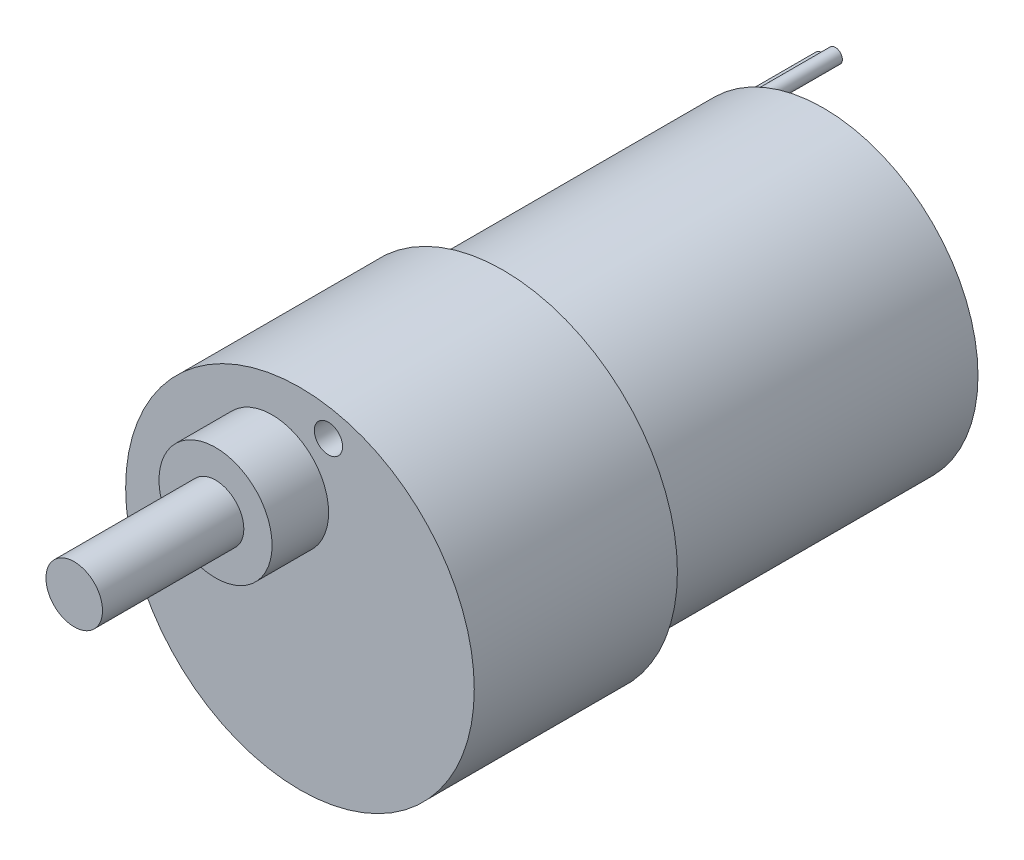
ISO-10303-21;
HEADER;
FILE_DESCRIPTION(('STEP AP214'),'2;1');
FILE_NAME('part.step','',(''),(''),'','','');
FILE_SCHEMA(('AUTOMOTIVE_DESIGN { 1 0 10303 214 1 1 1 1 }'));
ENDSEC;
DATA;
#1=APPLICATION_CONTEXT('core data for automotive mechanical design processes');
#2=APPLICATION_PROTOCOL_DEFINITION('international standard','automotive_design',2000,#1);
#3=PRODUCT_CONTEXT('',#1,'mechanical');
#4=PRODUCT('Part','Part','',(#3));
#5=PRODUCT_RELATED_PRODUCT_CATEGORY('part','',(#4));
#6=PRODUCT_DEFINITION_FORMATION('','',#4);
#7=PRODUCT_DEFINITION_CONTEXT('part definition',#1,'design');
#8=PRODUCT_DEFINITION('design','',#6,#7);
#9=PRODUCT_DEFINITION_SHAPE('','',#8);
#10=(LENGTH_UNIT() NAMED_UNIT(*) SI_UNIT(.MILLI.,.METRE.));
#11=(NAMED_UNIT(*) PLANE_ANGLE_UNIT() SI_UNIT($,.RADIAN.));
#12=(NAMED_UNIT(*) SI_UNIT($,.STERADIAN.) SOLID_ANGLE_UNIT());
#13=UNCERTAINTY_MEASURE_WITH_UNIT(LENGTH_MEASURE(1.E-05),#10,'distance_accuracy_value','');
#14=(GEOMETRIC_REPRESENTATION_CONTEXT(3) GLOBAL_UNCERTAINTY_ASSIGNED_CONTEXT((#13)) GLOBAL_UNIT_ASSIGNED_CONTEXT((#10,
#11,#12)) REPRESENTATION_CONTEXT('',''));
#15=CARTESIAN_POINT('',(0.,0.,0.));
#16=DIRECTION('',(0.,0.,1.));
#17=DIRECTION('',(1.,0.,0.));
#18=AXIS2_PLACEMENT_3D('',#15,#16,#17);
#19=CARTESIAN_POINT('',(-38.6606230909148,1.93971984366182,21.56));
#20=DIRECTION('',(0.,0.,-1.));
#21=DIRECTION('',(-1.,0.,0.));
#22=AXIS2_PLACEMENT_3D('',#19,#20,#21);
#23=CYLINDRICAL_SURFACE('',#22,18.5);
#24=CARTESIAN_POINT('',(-38.6606230909148,1.93971984366182,21.56));
#25=DIRECTION('',(0.,0.,1.));
#26=DIRECTION('',(1.,0.,0.));
#27=AXIS2_PLACEMENT_3D('',#24,#25,#26);
#28=CIRCLE('',#27,18.5);
#29=CARTESIAN_POINT('',(-20.1606230909148,1.93971984366182,21.56));
#30=VERTEX_POINT('',#29);
#31=EDGE_CURVE('E43',#30,#30,#28,.T.);
#32=ORIENTED_EDGE('',*,*,#31,.F.);
#33=EDGE_LOOP('',(#32));
#34=FACE_BOUND('',#33,.T.);
#35=CARTESIAN_POINT('',(-38.6606230909148,1.93971984366182,0.));
#36=DIRECTION('',(0.,0.,1.));
#37=DIRECTION('',(1.,0.,0.));
#38=AXIS2_PLACEMENT_3D('',#35,#36,#37);
#39=CIRCLE('',#38,18.5);
#40=CARTESIAN_POINT('',(-20.1606230909148,1.93971984366182,0.));
#41=VERTEX_POINT('',#40);
#42=EDGE_CURVE('E34',#41,#41,#39,.T.);
#43=ORIENTED_EDGE('',*,*,#42,.T.);
#44=EDGE_LOOP('',(#43));
#45=FACE_BOUND('',#44,.T.);
#46=ADVANCED_FACE('F31',(#34,#45),#23,.T.);
#47=CARTESIAN_POINT('',(-38.6606230909148,1.93971984366182,21.56));
#48=DIRECTION('',(0.,0.,1.));
#49=DIRECTION('',(1.,0.,0.));
#50=AXIS2_PLACEMENT_3D('',#47,#48,#49);
#51=PLANE('',#50);
#52=CARTESIAN_POINT('',(-35.6385530954242,17.2482006752359,21.56));
#53=DIRECTION('',(0.,0.,1.));
#54=DIRECTION('',(1.,0.,0.));
#55=AXIS2_PLACEMENT_3D('',#52,#53,#54);
#56=CIRCLE('',#55,1.5);
#57=CARTESIAN_POINT('',(-34.1385530954242,17.2482006752359,21.56));
#58=VERTEX_POINT('',#57);
#59=EDGE_CURVE('E53',#58,#58,#56,.T.);
#60=ORIENTED_EDGE('',*,*,#59,.F.);
#61=EDGE_LOOP('',(#60));
#62=FACE_BOUND('',#61,.T.);
#63=CARTESIAN_POINT('',(-41.6188546381153,10.4396531441735,21.56));
#64=DIRECTION('',(0.,0.,1.));
#65=DIRECTION('',(1.,0.,0.));
#66=AXIS2_PLACEMENT_3D('',#63,#64,#65);
#67=CIRCLE('',#66,6.);
#68=CARTESIAN_POINT('',(-35.6188546381153,10.4396531441735,21.56));
#69=VERTEX_POINT('',#68);
#70=EDGE_CURVE('E57',#69,#69,#67,.T.);
#71=ORIENTED_EDGE('',*,*,#70,.F.);
#72=EDGE_LOOP('',(#71));
#73=FACE_BOUND('',#72,.T.);
#74=ORIENTED_EDGE('',*,*,#31,.T.);
#75=EDGE_LOOP('',(#74));
#76=FACE_BOUND('',#75,.T.);
#77=ADVANCED_FACE('F73',(#62,#73,#76),#51,.T.);
#78=CARTESIAN_POINT('',(-38.6606230909148,1.93971984366182,0.));
#79=DIRECTION('',(0.,0.,1.));
#80=DIRECTION('',(1.,0.,0.));
#81=AXIS2_PLACEMENT_3D('',#78,#79,#80);
#82=PLANE('',#81);
#83=CARTESIAN_POINT('',(-38.6606230909148,1.93971984366182,0.));
#84=DIRECTION('',(0.,0.,-1.));
#85=DIRECTION('',(-1.,0.,0.));
#86=AXIS2_PLACEMENT_3D('',#83,#84,#85);
#87=CIRCLE('',#86,16.4);
#88=CARTESIAN_POINT('',(-55.0606230909148,1.93971984366182,0.));
#89=VERTEX_POINT('',#88);
#90=EDGE_CURVE('E10',#89,#89,#87,.T.);
#91=ORIENTED_EDGE('',*,*,#90,.F.);
#92=EDGE_LOOP('',(#91));
#93=FACE_BOUND('',#92,.T.);
#94=ORIENTED_EDGE('',*,*,#42,.F.);
#95=EDGE_LOOP('',(#94));
#96=FACE_BOUND('',#95,.T.);
#97=ADVANCED_FACE('F70',(#93,#96),#82,.F.);
#98=CARTESIAN_POINT('',(-41.6188546381153,10.4396531441735,27.56));
#99=DIRECTION('',(0.,0.,-1.));
#100=DIRECTION('',(-1.,0.,0.));
#101=AXIS2_PLACEMENT_3D('',#98,#99,#100);
#102=CYLINDRICAL_SURFACE('',#101,6.);
#103=CARTESIAN_POINT('',(-41.6188546381153,10.4396531441735,27.56));
#104=DIRECTION('',(0.,0.,1.));
#105=DIRECTION('',(1.,0.,0.));
#106=AXIS2_PLACEMENT_3D('',#103,#104,#105);
#107=CIRCLE('',#106,6.);
#108=CARTESIAN_POINT('',(-35.6188546381153,10.4396531441735,27.56));
#109=VERTEX_POINT('',#108);
#110=EDGE_CURVE('E59',#109,#109,#107,.T.);
#111=ORIENTED_EDGE('',*,*,#110,.F.);
#112=EDGE_LOOP('',(#111));
#113=FACE_BOUND('',#112,.T.);
#114=ORIENTED_EDGE('',*,*,#70,.T.);
#115=EDGE_LOOP('',(#114));
#116=FACE_BOUND('',#115,.T.);
#117=ADVANCED_FACE('F72',(#113,#116),#102,.T.);
#118=CARTESIAN_POINT('',(-41.6188546381153,10.4396531441735,27.56));
#119=DIRECTION('',(0.,0.,1.));
#120=DIRECTION('',(1.,0.,0.));
#121=AXIS2_PLACEMENT_3D('',#118,#119,#120);
#122=PLANE('',#121);
#123=CARTESIAN_POINT('',(-41.6188546381153,10.4396531441735,27.56));
#124=DIRECTION('',(0.,0.,1.));
#125=DIRECTION('',(1.,0.,0.));
#126=AXIS2_PLACEMENT_3D('',#123,#124,#125);
#127=CIRCLE('',#126,3.);
#128=CARTESIAN_POINT('',(-38.6188546381153,10.4396531441735,27.56));
#129=VERTEX_POINT('',#128);
#130=EDGE_CURVE('E38',#129,#129,#127,.T.);
#131=ORIENTED_EDGE('',*,*,#130,.F.);
#132=EDGE_LOOP('',(#131));
#133=FACE_BOUND('',#132,.T.);
#134=ORIENTED_EDGE('',*,*,#110,.T.);
#135=EDGE_LOOP('',(#134));
#136=FACE_BOUND('',#135,.T.);
#137=ADVANCED_FACE('F79',(#133,#136),#122,.T.);
#138=CARTESIAN_POINT('',(-41.6188546381153,10.4396531441735,42.56));
#139=DIRECTION('',(0.,0.,-1.));
#140=DIRECTION('',(-1.,0.,0.));
#141=AXIS2_PLACEMENT_3D('',#138,#139,#140);
#142=CYLINDRICAL_SURFACE('',#141,3.);
#143=CARTESIAN_POINT('',(-41.6188546381153,10.4396531441735,42.56));
#144=DIRECTION('',(0.,0.,1.));
#145=DIRECTION('',(1.,0.,0.));
#146=AXIS2_PLACEMENT_3D('',#143,#144,#145);
#147=CIRCLE('',#146,3.);
#148=CARTESIAN_POINT('',(-38.6188546381153,10.4396531441735,42.56));
#149=VERTEX_POINT('',#148);
#150=EDGE_CURVE('E52',#149,#149,#147,.T.);
#151=ORIENTED_EDGE('',*,*,#150,.F.);
#152=EDGE_LOOP('',(#151));
#153=FACE_BOUND('',#152,.T.);
#154=ORIENTED_EDGE('',*,*,#130,.T.);
#155=EDGE_LOOP('',(#154));
#156=FACE_BOUND('',#155,.T.);
#157=ADVANCED_FACE('F191',(#153,#156),#142,.T.);
#158=CARTESIAN_POINT('',(-41.6188546381153,10.4396531441735,42.56));
#159=DIRECTION('',(0.,0.,1.));
#160=DIRECTION('',(1.,0.,0.));
#161=AXIS2_PLACEMENT_3D('',#158,#159,#160);
#162=PLANE('',#161);
#163=ORIENTED_EDGE('',*,*,#150,.T.);
#164=EDGE_LOOP('',(#163));
#165=FACE_BOUND('',#164,.T.);
#166=ADVANCED_FACE('F100',(#165),#162,.T.);
#167=CARTESIAN_POINT('',(-35.6385530954242,17.2482006752359,17.56));
#168=DIRECTION('',(0.,0.,1.));
#169=DIRECTION('',(1.,0.,0.));
#170=AXIS2_PLACEMENT_3D('',#167,#168,#169);
#171=CYLINDRICAL_SURFACE('',#170,1.5);
#172=CARTESIAN_POINT('',(-35.6385530954242,17.2482006752359,17.56));
#173=DIRECTION('',(0.,0.,1.));
#174=DIRECTION('',(1.,0.,0.));
#175=AXIS2_PLACEMENT_3D('',#172,#173,#174);
#176=CIRCLE('',#175,1.5);
#177=CARTESIAN_POINT('',(-34.1385530954242,17.2482006752359,17.56));
#178=VERTEX_POINT('',#177);
#179=EDGE_CURVE('E49',#178,#178,#176,.T.);
#180=ORIENTED_EDGE('',*,*,#179,.F.);
#181=EDGE_LOOP('',(#180));
#182=FACE_BOUND('',#181,.T.);
#183=ORIENTED_EDGE('',*,*,#59,.T.);
#184=EDGE_LOOP('',(#183));
#185=FACE_BOUND('',#184,.T.);
#186=ADVANCED_FACE('F105',(#182,#185),#171,.F.);
#187=CARTESIAN_POINT('',(-35.6385530954242,17.2482006752359,17.56));
#188=DIRECTION('',(0.,0.,1.));
#189=DIRECTION('',(1.,0.,0.));
#190=AXIS2_PLACEMENT_3D('',#187,#188,#189);
#191=PLANE('',#190);
#192=ORIENTED_EDGE('',*,*,#179,.T.);
#193=EDGE_LOOP('',(#192));
#194=FACE_BOUND('',#193,.T.);
#195=ADVANCED_FACE('F110',(#194),#191,.T.);
#196=CARTESIAN_POINT('',(-38.6606230909148,1.93971984366182,-34.));
#197=DIRECTION('',(0.,0.,1.));
#198=DIRECTION('',(1.,0.,0.));
#199=AXIS2_PLACEMENT_3D('',#196,#197,#198);
#200=CYLINDRICAL_SURFACE('',#199,16.4);
#201=CARTESIAN_POINT('',(-38.6606230909148,1.93971984366182,-34.));
#202=DIRECTION('',(0.,0.,-1.));
#203=DIRECTION('',(-1.,0.,0.));
#204=AXIS2_PLACEMENT_3D('',#201,#202,#203);
#205=CIRCLE('',#204,16.4);
#206=CARTESIAN_POINT('',(-55.0606230909148,1.93971984366182,-34.));
#207=VERTEX_POINT('',#206);
#208=EDGE_CURVE('E47',#207,#207,#205,.T.);
#209=ORIENTED_EDGE('',*,*,#208,.F.);
#210=EDGE_LOOP('',(#209));
#211=FACE_BOUND('',#210,.T.);
#212=ORIENTED_EDGE('',*,*,#90,.T.);
#213=EDGE_LOOP('',(#212));
#214=FACE_BOUND('',#213,.T.);
#215=ADVANCED_FACE('F119',(#211,#214),#200,.T.);
#216=CARTESIAN_POINT('',(-38.6606230909148,1.93971984366182,-34.));
#217=DIRECTION('',(0.,0.,-1.));
#218=DIRECTION('',(-1.,0.,0.));
#219=AXIS2_PLACEMENT_3D('',#216,#217,#218);
#220=PLANE('',#219);
#221=CARTESIAN_POINT('',(-48.9022241136325,12.5823920871682,-34.));
#222=DIRECTION('',(0.,0.,-1.));
#223=DIRECTION('',(-1.,0.,0.));
#224=AXIS2_PLACEMENT_3D('',#221,#222,#223);
#225=CIRCLE('',#224,0.749999999999999);
#226=CARTESIAN_POINT('',(-49.6522241136325,12.5823920871682,-34.));
#227=VERTEX_POINT('',#226);
#228=EDGE_CURVE('E227',#227,#227,#225,.T.);
#229=ORIENTED_EDGE('',*,*,#228,.F.);
#230=EDGE_LOOP('',(#229));
#231=FACE_BOUND('',#230,.T.);
#232=CARTESIAN_POINT('',(-47.4066804105604,13.7941353195856,-34.));
#233=DIRECTION('',(0.,0.,-1.));
#234=DIRECTION('',(-1.,0.,0.));
#235=AXIS2_PLACEMENT_3D('',#232,#233,#234);
#236=CIRCLE('',#235,0.749999999999999);
#237=CARTESIAN_POINT('',(-48.1566804105604,13.7941353195856,-34.));
#238=VERTEX_POINT('',#237);
#239=EDGE_CURVE('E226',#238,#238,#236,.T.);
#240=ORIENTED_EDGE('',*,*,#239,.F.);
#241=EDGE_LOOP('',(#240));
#242=FACE_BOUND('',#241,.T.);
#243=ORIENTED_EDGE('',*,*,#208,.T.);
#244=EDGE_LOOP('',(#243));
#245=FACE_BOUND('',#244,.T.);
#246=ADVANCED_FACE('F134',(#231,#242,#245),#220,.T.);
#247=CARTESIAN_POINT('',(-47.4066804105604,13.7941353195856,-44.));
#248=DIRECTION('',(0.,0.,1.));
#249=DIRECTION('',(1.,0.,0.));
#250=AXIS2_PLACEMENT_3D('',#247,#248,#249);
#251=CYLINDRICAL_SURFACE('',#250,0.749999999999999);
#252=CARTESIAN_POINT('',(-47.4066804105604,13.7941353195856,-44.));
#253=DIRECTION('',(0.,0.,-1.));
#254=DIRECTION('',(-1.,0.,0.));
#255=AXIS2_PLACEMENT_3D('',#252,#253,#254);
#256=CIRCLE('',#255,0.749999999999999);
#257=CARTESIAN_POINT('',(-48.1566804105604,13.7941353195856,-44.));
#258=VERTEX_POINT('',#257);
#259=EDGE_CURVE('E230',#258,#258,#256,.T.);
#260=ORIENTED_EDGE('',*,*,#259,.F.);
#261=EDGE_LOOP('',(#260));
#262=FACE_BOUND('',#261,.T.);
#263=ORIENTED_EDGE('',*,*,#239,.T.);
#264=EDGE_LOOP('',(#263));
#265=FACE_BOUND('',#264,.T.);
#266=ADVANCED_FACE('F142',(#262,#265),#251,.T.);
#267=CARTESIAN_POINT('',(-47.4066804105604,13.7941353195856,-44.));
#268=DIRECTION('',(0.,0.,-1.));
#269=DIRECTION('',(-1.,0.,0.));
#270=AXIS2_PLACEMENT_3D('',#267,#268,#269);
#271=PLANE('',#270);
#272=ORIENTED_EDGE('',*,*,#259,.T.);
#273=EDGE_LOOP('',(#272));
#274=FACE_BOUND('',#273,.T.);
#275=ADVANCED_FACE('F147',(#274),#271,.T.);
#276=CARTESIAN_POINT('',(-48.9022241136325,12.5823920871682,-44.));
#277=DIRECTION('',(0.,0.,1.));
#278=DIRECTION('',(1.,0.,0.));
#279=AXIS2_PLACEMENT_3D('',#276,#277,#278);
#280=CYLINDRICAL_SURFACE('',#279,0.749999999999999);
#281=CARTESIAN_POINT('',(-48.9022241136325,12.5823920871682,-44.));
#282=DIRECTION('',(0.,0.,-1.));
#283=DIRECTION('',(-1.,0.,0.));
#284=AXIS2_PLACEMENT_3D('',#281,#282,#283);
#285=CIRCLE('',#284,0.749999999999999);
#286=CARTESIAN_POINT('',(-49.6522241136325,12.5823920871682,-44.));
#287=VERTEX_POINT('',#286);
#288=EDGE_CURVE('E225',#287,#287,#285,.T.);
#289=ORIENTED_EDGE('',*,*,#288,.F.);
#290=EDGE_LOOP('',(#289));
#291=FACE_BOUND('',#290,.T.);
#292=ORIENTED_EDGE('',*,*,#228,.T.);
#293=EDGE_LOOP('',(#292));
#294=FACE_BOUND('',#293,.T.);
#295=ADVANCED_FACE('F157',(#291,#294),#280,.T.);
#296=CARTESIAN_POINT('',(-48.9022241136325,12.5823920871682,-44.));
#297=DIRECTION('',(0.,0.,-1.));
#298=DIRECTION('',(-1.,0.,0.));
#299=AXIS2_PLACEMENT_3D('',#296,#297,#298);
#300=PLANE('',#299);
#301=ORIENTED_EDGE('',*,*,#288,.T.);
#302=EDGE_LOOP('',(#301));
#303=FACE_BOUND('',#302,.T.);
#304=ADVANCED_FACE('F174',(#303),#300,.T.);
#305=CLOSED_SHELL('',(#46,#77,#97,#117,#137,#157,#166,#186,#195,#215,#246,#266,#275,#295,#304));
#306=MANIFOLD_SOLID_BREP('B2',#305);
#307=ADVANCED_BREP_SHAPE_REPRESENTATION('',(#18,#306),#14);
#308=SHAPE_DEFINITION_REPRESENTATION(#9,#307);
ENDSEC;
END-ISO-10303-21;
